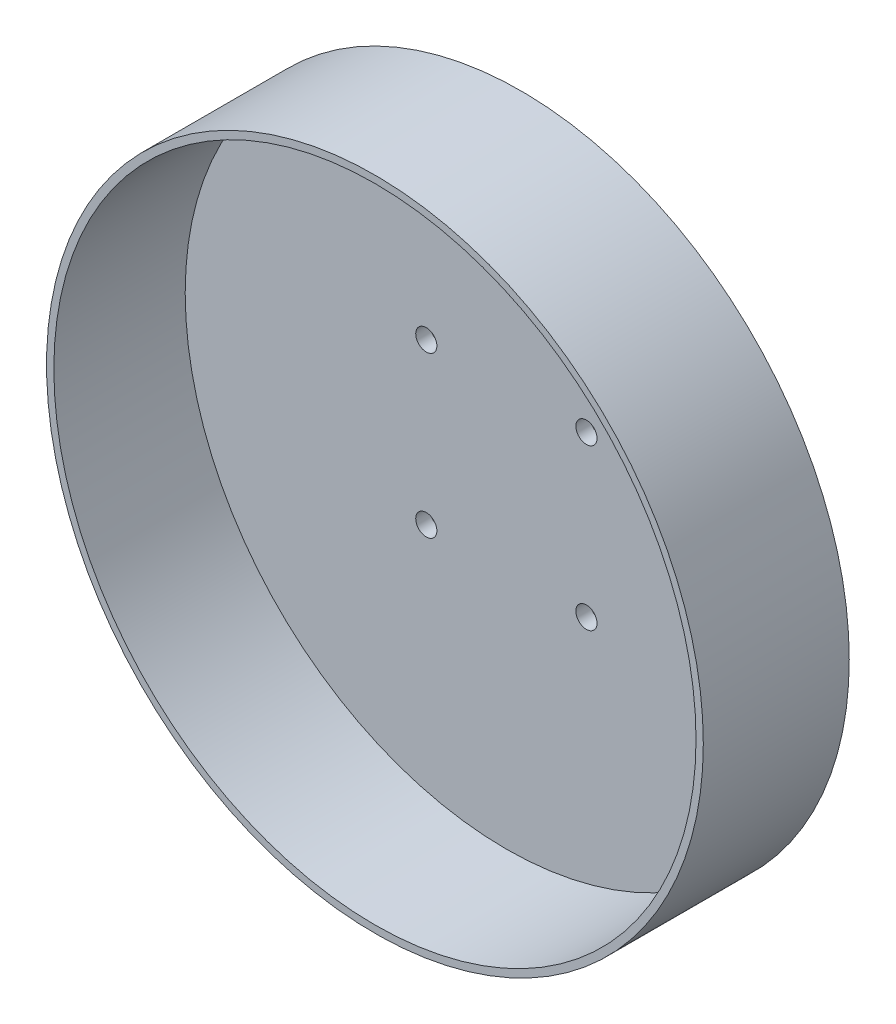
ISO-10303-21;
HEADER;
FILE_DESCRIPTION(('STEP AP214'),'2;1');
FILE_NAME('part.step','',(''),(''),'','','');
FILE_SCHEMA(('AUTOMOTIVE_DESIGN { 1 0 10303 214 1 1 1 1 }'));
ENDSEC;
DATA;
#1=APPLICATION_CONTEXT('core data for automotive mechanical design processes');
#2=APPLICATION_PROTOCOL_DEFINITION('international standard','automotive_design',2000,#1);
#3=PRODUCT_CONTEXT('',#1,'mechanical');
#4=PRODUCT('Part','Part','',(#3));
#5=PRODUCT_RELATED_PRODUCT_CATEGORY('part','',(#4));
#6=PRODUCT_DEFINITION_FORMATION('','',#4);
#7=PRODUCT_DEFINITION_CONTEXT('part definition',#1,'design');
#8=PRODUCT_DEFINITION('design','',#6,#7);
#9=PRODUCT_DEFINITION_SHAPE('','',#8);
#10=(LENGTH_UNIT() NAMED_UNIT(*) SI_UNIT(.MILLI.,.METRE.));
#11=(NAMED_UNIT(*) PLANE_ANGLE_UNIT() SI_UNIT($,.RADIAN.));
#12=(NAMED_UNIT(*) SI_UNIT($,.STERADIAN.) SOLID_ANGLE_UNIT());
#13=UNCERTAINTY_MEASURE_WITH_UNIT(LENGTH_MEASURE(1.E-05),#10,'distance_accuracy_value','');
#14=(GEOMETRIC_REPRESENTATION_CONTEXT(3) GLOBAL_UNCERTAINTY_ASSIGNED_CONTEXT((#13)) GLOBAL_UNIT_ASSIGNED_CONTEXT((#10,
#11,#12)) REPRESENTATION_CONTEXT('',''));
#15=CARTESIAN_POINT('',(0.,0.,0.));
#16=DIRECTION('',(0.,0.,1.));
#17=DIRECTION('',(1.,0.,0.));
#18=AXIS2_PLACEMENT_3D('',#15,#16,#17);
#19=CARTESIAN_POINT('',(0.,0.,-1.99999999999999));
#20=DIRECTION('',(0.,0.,1.));
#21=DIRECTION('',(1.,0.,0.));
#22=AXIS2_PLACEMENT_3D('',#19,#20,#21);
#23=PLANE('',#22);
#24=CARTESIAN_POINT('',(-10.9601551083916,-10.9829379988892,-1.99999999999999));
#25=DIRECTION('',(0.,0.,-1.));
#26=DIRECTION('',(-1.,0.,0.));
#27=AXIS2_PLACEMENT_3D('',#24,#25,#26);
#28=CIRCLE('',#27,1.45);
#29=CARTESIAN_POINT('',(-12.4101551083916,-10.9829379988892,-1.99999999999999));
#30=VERTEX_POINT('',#29);
#31=EDGE_CURVE('E89',#30,#30,#28,.T.);
#32=ORIENTED_EDGE('',*,*,#31,.F.);
#33=EDGE_LOOP('',(#32));
#34=FACE_BOUND('',#33,.T.);
#35=CARTESIAN_POINT('',(10.9829379988893,10.9601551083914,-1.99999999999999));
#36=DIRECTION('',(0.,0.,-1.));
#37=DIRECTION('',(-1.,0.,0.));
#38=AXIS2_PLACEMENT_3D('',#35,#36,#37);
#39=CIRCLE('',#38,1.45);
#40=CARTESIAN_POINT('',(9.53293799888935,10.9601551083914,-1.99999999999999));
#41=VERTEX_POINT('',#40);
#42=EDGE_CURVE('E73',#41,#41,#39,.T.);
#43=ORIENTED_EDGE('',*,*,#42,.F.);
#44=EDGE_LOOP('',(#43));
#45=FACE_BOUND('',#44,.T.);
#46=CARTESIAN_POINT('',(-10.9601551083915,10.9601551083915,-1.99999999999999));
#47=DIRECTION('',(0.,0.,-1.));
#48=DIRECTION('',(-1.,0.,0.));
#49=AXIS2_PLACEMENT_3D('',#46,#47,#48);
#50=CIRCLE('',#49,1.45);
#51=CARTESIAN_POINT('',(-12.4101551083915,10.9601551083915,-1.99999999999999));
#52=VERTEX_POINT('',#51);
#53=EDGE_CURVE('E65',#52,#52,#50,.T.);
#54=ORIENTED_EDGE('',*,*,#53,.F.);
#55=EDGE_LOOP('',(#54));
#56=FACE_BOUND('',#55,.T.);
#57=CARTESIAN_POINT('',(0.,0.,-1.99999999999999));
#58=DIRECTION('',(0.,0.,1.));
#59=DIRECTION('',(1.,0.,0.));
#60=AXIS2_PLACEMENT_3D('',#57,#58,#59);
#61=CIRCLE('',#60,45.);
#62=CARTESIAN_POINT('',(45.,0.,-1.99999999999999));
#63=VERTEX_POINT('',#62);
#64=EDGE_CURVE('E60',#63,#63,#61,.T.);
#65=ORIENTED_EDGE('',*,*,#64,.F.);
#66=EDGE_LOOP('',(#65));
#67=FACE_BOUND('',#66,.T.);
#68=CARTESIAN_POINT('',(10.9829379988893,-10.9829379988893,-1.99999999999999));
#69=DIRECTION('',(0.,0.,-1.));
#70=DIRECTION('',(-1.,0.,0.));
#71=AXIS2_PLACEMENT_3D('',#68,#69,#70);
#72=CIRCLE('',#71,1.45);
#73=CARTESIAN_POINT('',(9.53293799888926,-10.9829379988893,-1.99999999999999));
#74=VERTEX_POINT('',#73);
#75=EDGE_CURVE('E81',#74,#74,#72,.T.);
#76=ORIENTED_EDGE('',*,*,#75,.F.);
#77=EDGE_LOOP('',(#76));
#78=FACE_BOUND('',#77,.T.);
#79=ADVANCED_FACE('F41',(#34,#45,#56,#67,#78),#23,.F.);
#80=CARTESIAN_POINT('',(0.,0.,18.));
#81=DIRECTION('',(0.,0.,1.));
#82=DIRECTION('',(1.,0.,0.));
#83=AXIS2_PLACEMENT_3D('',#80,#81,#82);
#84=PLANE('',#83);
#85=CARTESIAN_POINT('',(0.,0.,18.));
#86=DIRECTION('',(0.,0.,1.));
#87=DIRECTION('',(1.,0.,0.));
#88=AXIS2_PLACEMENT_3D('',#85,#86,#87);
#89=CIRCLE('',#88,45.);
#90=CARTESIAN_POINT('',(45.,0.,18.));
#91=VERTEX_POINT('',#90);
#92=EDGE_CURVE('E10',#91,#91,#89,.T.);
#93=ORIENTED_EDGE('',*,*,#92,.T.);
#94=EDGE_LOOP('',(#93));
#95=FACE_BOUND('',#94,.T.);
#96=CARTESIAN_POINT('',(0.,0.,18.));
#97=DIRECTION('',(0.,0.,1.));
#98=DIRECTION('',(1.,0.,0.));
#99=AXIS2_PLACEMENT_3D('',#96,#97,#98);
#100=CIRCLE('',#99,44.);
#101=CARTESIAN_POINT('',(44.,0.,18.));
#102=VERTEX_POINT('',#101);
#103=EDGE_CURVE('E50',#102,#102,#100,.T.);
#104=ORIENTED_EDGE('',*,*,#103,.F.);
#105=EDGE_LOOP('',(#104));
#106=FACE_BOUND('',#105,.T.);
#107=ADVANCED_FACE('F98',(#95,#106),#84,.T.);
#108=CARTESIAN_POINT('',(0.,0.,18.));
#109=DIRECTION('',(0.,0.,-1.));
#110=DIRECTION('',(-1.,0.,0.));
#111=AXIS2_PLACEMENT_3D('',#108,#109,#110);
#112=CYLINDRICAL_SURFACE('',#111,45.);
#113=ORIENTED_EDGE('',*,*,#92,.F.);
#114=EDGE_LOOP('',(#113));
#115=FACE_BOUND('',#114,.T.);
#116=ORIENTED_EDGE('',*,*,#64,.T.);
#117=EDGE_LOOP('',(#116));
#118=FACE_BOUND('',#117,.T.);
#119=ADVANCED_FACE('F43',(#115,#118),#112,.T.);
#120=CARTESIAN_POINT('',(0.,0.,18.));
#121=DIRECTION('',(0.,0.,-1.));
#122=DIRECTION('',(-1.,0.,0.));
#123=AXIS2_PLACEMENT_3D('',#120,#121,#122);
#124=CYLINDRICAL_SURFACE('',#123,44.);
#125=ORIENTED_EDGE('',*,*,#103,.T.);
#126=EDGE_LOOP('',(#125));
#127=FACE_BOUND('',#126,.T.);
#128=CARTESIAN_POINT('',(0.,0.,0.));
#129=DIRECTION('',(0.,0.,1.));
#130=DIRECTION('',(1.,0.,0.));
#131=AXIS2_PLACEMENT_3D('',#128,#129,#130);
#132=CIRCLE('',#131,44.);
#133=CARTESIAN_POINT('',(44.,0.,0.));
#134=VERTEX_POINT('',#133);
#135=EDGE_CURVE('E55',#134,#134,#132,.T.);
#136=ORIENTED_EDGE('',*,*,#135,.F.);
#137=EDGE_LOOP('',(#136));
#138=FACE_BOUND('',#137,.T.);
#139=ADVANCED_FACE('F129',(#127,#138),#124,.F.);
#140=CARTESIAN_POINT('',(0.,0.,0.));
#141=DIRECTION('',(0.,0.,1.));
#142=DIRECTION('',(1.,0.,0.));
#143=AXIS2_PLACEMENT_3D('',#140,#141,#142);
#144=PLANE('',#143);
#145=CARTESIAN_POINT('',(-10.9601551083916,-10.9829379988892,0.));
#146=DIRECTION('',(0.,0.,1.));
#147=DIRECTION('',(1.,0.,0.));
#148=AXIS2_PLACEMENT_3D('',#145,#146,#147);
#149=CIRCLE('',#148,1.45);
#150=CARTESIAN_POINT('',(-9.51015510839163,-10.9829379988892,0.));
#151=VERTEX_POINT('',#150);
#152=EDGE_CURVE('E85',#151,#151,#149,.T.);
#153=ORIENTED_EDGE('',*,*,#152,.F.);
#154=EDGE_LOOP('',(#153));
#155=FACE_BOUND('',#154,.T.);
#156=CARTESIAN_POINT('',(10.9829379988893,-10.9829379988893,0.));
#157=DIRECTION('',(0.,0.,1.));
#158=DIRECTION('',(1.,0.,0.));
#159=AXIS2_PLACEMENT_3D('',#156,#157,#158);
#160=CIRCLE('',#159,1.45);
#161=CARTESIAN_POINT('',(12.4329379988893,-10.9829379988893,0.));
#162=VERTEX_POINT('',#161);
#163=EDGE_CURVE('E77',#162,#162,#160,.T.);
#164=ORIENTED_EDGE('',*,*,#163,.F.);
#165=EDGE_LOOP('',(#164));
#166=FACE_BOUND('',#165,.T.);
#167=CARTESIAN_POINT('',(10.9829379988893,10.9601551083914,0.));
#168=DIRECTION('',(0.,0.,1.));
#169=DIRECTION('',(1.,0.,0.));
#170=AXIS2_PLACEMENT_3D('',#167,#168,#169);
#171=CIRCLE('',#170,1.45);
#172=CARTESIAN_POINT('',(12.4329379988893,10.9601551083914,0.));
#173=VERTEX_POINT('',#172);
#174=EDGE_CURVE('E69',#173,#173,#171,.T.);
#175=ORIENTED_EDGE('',*,*,#174,.F.);
#176=EDGE_LOOP('',(#175));
#177=FACE_BOUND('',#176,.T.);
#178=CARTESIAN_POINT('',(-10.9601551083915,10.9601551083915,0.));
#179=DIRECTION('',(0.,0.,1.));
#180=DIRECTION('',(1.,0.,0.));
#181=AXIS2_PLACEMENT_3D('',#178,#179,#180);
#182=CIRCLE('',#181,1.45);
#183=CARTESIAN_POINT('',(-9.51015510839147,10.9601551083915,0.));
#184=VERTEX_POINT('',#183);
#185=EDGE_CURVE('E45',#184,#184,#182,.T.);
#186=ORIENTED_EDGE('',*,*,#185,.F.);
#187=EDGE_LOOP('',(#186));
#188=FACE_BOUND('',#187,.T.);
#189=ORIENTED_EDGE('',*,*,#135,.T.);
#190=EDGE_LOOP('',(#189));
#191=FACE_BOUND('',#190,.T.);
#192=ADVANCED_FACE('F124',(#155,#166,#177,#188,#191),#144,.T.);
#193=CARTESIAN_POINT('',(-10.9601551083915,10.9601551083915,-1.99999999999999));
#194=DIRECTION('',(0.,0.,-1.));
#195=DIRECTION('',(-1.,0.,0.));
#196=AXIS2_PLACEMENT_3D('',#193,#194,#195);
#197=CYLINDRICAL_SURFACE('',#196,1.45);
#198=ORIENTED_EDGE('',*,*,#185,.T.);
#199=EDGE_LOOP('',(#198));
#200=FACE_BOUND('',#199,.T.);
#201=ORIENTED_EDGE('',*,*,#53,.T.);
#202=EDGE_LOOP('',(#201));
#203=FACE_BOUND('',#202,.T.);
#204=ADVANCED_FACE('F119',(#200,#203),#197,.F.);
#205=CARTESIAN_POINT('',(10.9829379988893,10.9601551083914,-1.99999999999999));
#206=DIRECTION('',(0.,0.,-1.));
#207=DIRECTION('',(-1.,0.,0.));
#208=AXIS2_PLACEMENT_3D('',#205,#206,#207);
#209=CYLINDRICAL_SURFACE('',#208,1.45);
#210=ORIENTED_EDGE('',*,*,#174,.T.);
#211=EDGE_LOOP('',(#210));
#212=FACE_BOUND('',#211,.T.);
#213=ORIENTED_EDGE('',*,*,#42,.T.);
#214=EDGE_LOOP('',(#213));
#215=FACE_BOUND('',#214,.T.);
#216=ADVANCED_FACE('F110',(#212,#215),#209,.F.);
#217=CARTESIAN_POINT('',(10.9829379988893,-10.9829379988893,-1.99999999999999));
#218=DIRECTION('',(0.,0.,-1.));
#219=DIRECTION('',(-1.,0.,0.));
#220=AXIS2_PLACEMENT_3D('',#217,#218,#219);
#221=CYLINDRICAL_SURFACE('',#220,1.45);
#222=ORIENTED_EDGE('',*,*,#163,.T.);
#223=EDGE_LOOP('',(#222));
#224=FACE_BOUND('',#223,.T.);
#225=ORIENTED_EDGE('',*,*,#75,.T.);
#226=EDGE_LOOP('',(#225));
#227=FACE_BOUND('',#226,.T.);
#228=ADVANCED_FACE('F108',(#224,#227),#221,.F.);
#229=CARTESIAN_POINT('',(-10.9601551083916,-10.9829379988892,-1.99999999999999));
#230=DIRECTION('',(0.,0.,-1.));
#231=DIRECTION('',(-1.,0.,0.));
#232=AXIS2_PLACEMENT_3D('',#229,#230,#231);
#233=CYLINDRICAL_SURFACE('',#232,1.45);
#234=ORIENTED_EDGE('',*,*,#152,.T.);
#235=EDGE_LOOP('',(#234));
#236=FACE_BOUND('',#235,.T.);
#237=ORIENTED_EDGE('',*,*,#31,.T.);
#238=EDGE_LOOP('',(#237));
#239=FACE_BOUND('',#238,.T.);
#240=ADVANCED_FACE('F94',(#236,#239),#233,.F.);
#241=CLOSED_SHELL('',(#79,#107,#119,#139,#192,#204,#216,#228,#240));
#242=MANIFOLD_SOLID_BREP('B2',#241);
#243=ADVANCED_BREP_SHAPE_REPRESENTATION('',(#18,#242),#14);
#244=SHAPE_DEFINITION_REPRESENTATION(#9,#243);
ENDSEC;
END-ISO-10303-21;
